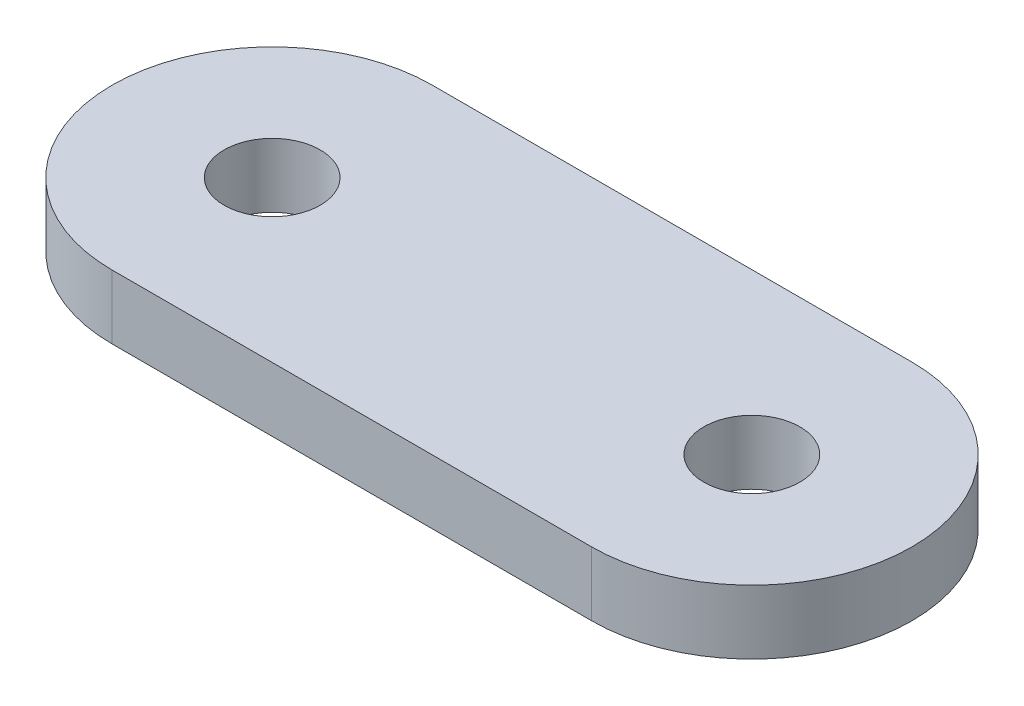
ISO-10303-21;
HEADER;
FILE_DESCRIPTION(('STEP AP214'),'2;1');
FILE_NAME('part.step','',(''),(''),'','','');
FILE_SCHEMA(('AUTOMOTIVE_DESIGN { 1 0 10303 214 1 1 1 1 }'));
ENDSEC;
DATA;
#1=APPLICATION_CONTEXT('core data for automotive mechanical design processes');
#2=APPLICATION_PROTOCOL_DEFINITION('international standard','automotive_design',2000,#1);
#3=PRODUCT_CONTEXT('',#1,'mechanical');
#4=PRODUCT('Part','Part','',(#3));
#5=PRODUCT_RELATED_PRODUCT_CATEGORY('part','',(#4));
#6=PRODUCT_DEFINITION_FORMATION('','',#4);
#7=PRODUCT_DEFINITION_CONTEXT('part definition',#1,'design');
#8=PRODUCT_DEFINITION('design','',#6,#7);
#9=PRODUCT_DEFINITION_SHAPE('','',#8);
#10=(LENGTH_UNIT() NAMED_UNIT(*) SI_UNIT(.MILLI.,.METRE.));
#11=(NAMED_UNIT(*) PLANE_ANGLE_UNIT() SI_UNIT($,.RADIAN.));
#12=(NAMED_UNIT(*) SI_UNIT($,.STERADIAN.) SOLID_ANGLE_UNIT());
#13=UNCERTAINTY_MEASURE_WITH_UNIT(LENGTH_MEASURE(1.E-05),#10,'distance_accuracy_value','');
#14=(GEOMETRIC_REPRESENTATION_CONTEXT(3) GLOBAL_UNCERTAINTY_ASSIGNED_CONTEXT((#13)) GLOBAL_UNIT_ASSIGNED_CONTEXT((#10,
#11,#12)) REPRESENTATION_CONTEXT('',''));
#15=CARTESIAN_POINT('',(0.,0.,0.));
#16=DIRECTION('',(0.,0.,1.));
#17=DIRECTION('',(1.,0.,0.));
#18=AXIS2_PLACEMENT_3D('',#15,#16,#17);
#19=CARTESIAN_POINT('',(-7.49,2.,0.));
#20=DIRECTION('',(0.,1.,0.));
#21=DIRECTION('',(0.,0.,1.));
#22=AXIS2_PLACEMENT_3D('',#19,#20,#21);
#23=PLANE('',#22);
#24=CARTESIAN_POINT('',(7.49,2.,0.));
#25=DIRECTION('',(0.,1.,0.));
#26=DIRECTION('',(0.,0.,1.));
#27=AXIS2_PLACEMENT_3D('',#24,#25,#26);
#28=CIRCLE('',#27,1.5);
#29=CARTESIAN_POINT('',(7.49,2.,1.5));
#30=VERTEX_POINT('',#29);
#31=EDGE_CURVE('E102',#30,#30,#28,.T.);
#32=ORIENTED_EDGE('',*,*,#31,.F.);
#33=EDGE_LOOP('',(#32));
#34=FACE_BOUND('',#33,.T.);
#35=CARTESIAN_POINT('',(-7.49,2.,0.));
#36=DIRECTION('',(0.,1.,0.));
#37=DIRECTION('',(0.,0.,1.));
#38=AXIS2_PLACEMENT_3D('',#35,#36,#37);
#39=CIRCLE('',#38,5.);
#40=CARTESIAN_POINT('',(-7.49,2.,-5.));
#41=VERTEX_POINT('',#40);
#42=CARTESIAN_POINT('',(-7.49,2.,5.));
#43=VERTEX_POINT('',#42);
#44=EDGE_CURVE('E87',#41,#43,#39,.T.);
#45=ORIENTED_EDGE('',*,*,#44,.T.);
#46=DIRECTION('',(1.,0.,0.));
#47=VECTOR('',#46,1.);
#48=CARTESIAN_POINT('',(-7.49,2.,5.));
#49=LINE('',#48,#47);
#50=CARTESIAN_POINT('',(7.49,2.,5.));
#51=VERTEX_POINT('',#50);
#52=EDGE_CURVE('E82',#43,#51,#49,.T.);
#53=ORIENTED_EDGE('',*,*,#52,.T.);
#54=CARTESIAN_POINT('',(7.49,2.,0.));
#55=DIRECTION('',(0.,1.,0.));
#56=DIRECTION('',(0.,0.,1.));
#57=AXIS2_PLACEMENT_3D('',#54,#55,#56);
#58=CIRCLE('',#57,5.);
#59=CARTESIAN_POINT('',(7.49,2.,-5.));
#60=VERTEX_POINT('',#59);
#61=EDGE_CURVE('E85',#51,#60,#58,.T.);
#62=ORIENTED_EDGE('',*,*,#61,.T.);
#63=DIRECTION('',(-1.,0.,0.));
#64=VECTOR('',#63,1.);
#65=CARTESIAN_POINT('',(-7.49,2.,-5.));
#66=LINE('',#65,#64);
#67=EDGE_CURVE('E52',#60,#41,#66,.T.);
#68=ORIENTED_EDGE('',*,*,#67,.T.);
#69=EDGE_LOOP('',(#45,#53,#62,#68));
#70=FACE_BOUND('',#69,.T.);
#71=CARTESIAN_POINT('',(-7.49,2.,0.));
#72=DIRECTION('',(0.,1.,0.));
#73=DIRECTION('',(0.,0.,1.));
#74=AXIS2_PLACEMENT_3D('',#71,#72,#73);
#75=CIRCLE('',#74,1.5);
#76=CARTESIAN_POINT('',(-7.49,2.,1.5));
#77=VERTEX_POINT('',#76);
#78=EDGE_CURVE('E117',#77,#77,#75,.T.);
#79=ORIENTED_EDGE('',*,*,#78,.F.);
#80=EDGE_LOOP('',(#79));
#81=FACE_BOUND('',#80,.T.);
#82=ADVANCED_FACE('F35',(#34,#70,#81),#23,.T.);
#83=CARTESIAN_POINT('',(-7.49,0.,0.));
#84=DIRECTION('',(0.,1.,0.));
#85=DIRECTION('',(0.,0.,1.));
#86=AXIS2_PLACEMENT_3D('',#83,#84,#85);
#87=PLANE('',#86);
#88=CARTESIAN_POINT('',(-7.49,0.,0.));
#89=DIRECTION('',(0.,1.,0.));
#90=DIRECTION('',(0.,0.,1.));
#91=AXIS2_PLACEMENT_3D('',#88,#89,#90);
#92=CIRCLE('',#91,5.);
#93=CARTESIAN_POINT('',(-7.49,0.,-5.));
#94=VERTEX_POINT('',#93);
#95=CARTESIAN_POINT('',(-7.49,0.,5.));
#96=VERTEX_POINT('',#95);
#97=EDGE_CURVE('E99',#94,#96,#92,.T.);
#98=ORIENTED_EDGE('',*,*,#97,.F.);
#99=DIRECTION('',(-1.,0.,0.));
#100=VECTOR('',#99,1.);
#101=CARTESIAN_POINT('',(-7.49,0.,-5.));
#102=LINE('',#101,#100);
#103=CARTESIAN_POINT('',(7.49,0.,-5.));
#104=VERTEX_POINT('',#103);
#105=EDGE_CURVE('E75',#104,#94,#102,.T.);
#106=ORIENTED_EDGE('',*,*,#105,.F.);
#107=CARTESIAN_POINT('',(7.49,0.,0.));
#108=DIRECTION('',(0.,1.,0.));
#109=DIRECTION('',(0.,0.,1.));
#110=AXIS2_PLACEMENT_3D('',#107,#108,#109);
#111=CIRCLE('',#110,5.);
#112=CARTESIAN_POINT('',(7.49,0.,5.));
#113=VERTEX_POINT('',#112);
#114=EDGE_CURVE('E69',#113,#104,#111,.T.);
#115=ORIENTED_EDGE('',*,*,#114,.F.);
#116=DIRECTION('',(1.,0.,0.));
#117=VECTOR('',#116,1.);
#118=CARTESIAN_POINT('',(-7.49,0.,5.));
#119=LINE('',#118,#117);
#120=EDGE_CURVE('E91',#96,#113,#119,.T.);
#121=ORIENTED_EDGE('',*,*,#120,.F.);
#122=EDGE_LOOP('',(#98,#106,#115,#121));
#123=FACE_BOUND('',#122,.T.);
#124=CARTESIAN_POINT('',(7.49,0.,0.));
#125=DIRECTION('',(0.,1.,0.));
#126=DIRECTION('',(0.,0.,1.));
#127=AXIS2_PLACEMENT_3D('',#124,#125,#126);
#128=CIRCLE('',#127,1.5);
#129=CARTESIAN_POINT('',(7.49,0.,1.5));
#130=VERTEX_POINT('',#129);
#131=EDGE_CURVE('E114',#130,#130,#128,.T.);
#132=ORIENTED_EDGE('',*,*,#131,.T.);
#133=EDGE_LOOP('',(#132));
#134=FACE_BOUND('',#133,.T.);
#135=CARTESIAN_POINT('',(-7.49,0.,0.));
#136=DIRECTION('',(0.,1.,0.));
#137=DIRECTION('',(0.,0.,1.));
#138=AXIS2_PLACEMENT_3D('',#135,#136,#137);
#139=CIRCLE('',#138,1.5);
#140=CARTESIAN_POINT('',(-7.49,0.,1.5));
#141=VERTEX_POINT('',#140);
#142=EDGE_CURVE('E120',#141,#141,#139,.T.);
#143=ORIENTED_EDGE('',*,*,#142,.T.);
#144=EDGE_LOOP('',(#143));
#145=FACE_BOUND('',#144,.T.);
#146=ADVANCED_FACE('F110',(#123,#134,#145),#87,.F.);
#147=CARTESIAN_POINT('',(-7.49,2.,0.));
#148=DIRECTION('',(0.,-1.,0.));
#149=DIRECTION('',(0.,0.,-1.));
#150=AXIS2_PLACEMENT_3D('',#147,#148,#149);
#151=CYLINDRICAL_SURFACE('',#150,5.);
#152=ORIENTED_EDGE('',*,*,#97,.T.);
#153=DIRECTION('',(0.,-1.,0.));
#154=VECTOR('',#153,1.);
#155=CARTESIAN_POINT('',(-7.49,2.,5.));
#156=LINE('',#155,#154);
#157=EDGE_CURVE('E11',#43,#96,#156,.T.);
#158=ORIENTED_EDGE('',*,*,#157,.F.);
#159=ORIENTED_EDGE('',*,*,#44,.F.);
#160=DIRECTION('',(0.,-1.,0.));
#161=VECTOR('',#160,1.);
#162=CARTESIAN_POINT('',(-7.49,2.,-5.));
#163=LINE('',#162,#161);
#164=EDGE_CURVE('E95',#41,#94,#163,.T.);
#165=ORIENTED_EDGE('',*,*,#164,.T.);
#166=EDGE_LOOP('',(#152,#158,#159,#165));
#167=FACE_BOUND('',#166,.T.);
#168=ADVANCED_FACE('F37',(#167),#151,.T.);
#169=CARTESIAN_POINT('',(-7.49,2.,5.));
#170=DIRECTION('',(0.,0.,-1.));
#171=DIRECTION('',(-1.,0.,0.));
#172=AXIS2_PLACEMENT_3D('',#169,#170,#171);
#173=PLANE('',#172);
#174=ORIENTED_EDGE('',*,*,#120,.T.);
#175=DIRECTION('',(0.,-1.,0.));
#176=VECTOR('',#175,1.);
#177=CARTESIAN_POINT('',(7.49,2.,5.));
#178=LINE('',#177,#176);
#179=EDGE_CURVE('E44',#51,#113,#178,.T.);
#180=ORIENTED_EDGE('',*,*,#179,.F.);
#181=ORIENTED_EDGE('',*,*,#52,.F.);
#182=ORIENTED_EDGE('',*,*,#157,.T.);
#183=EDGE_LOOP('',(#174,#180,#181,#182));
#184=FACE_BOUND('',#183,.T.);
#185=ADVANCED_FACE('F90',(#184),#173,.F.);
#186=CARTESIAN_POINT('',(7.49,2.,0.));
#187=DIRECTION('',(0.,-1.,0.));
#188=DIRECTION('',(0.,0.,-1.));
#189=AXIS2_PLACEMENT_3D('',#186,#187,#188);
#190=CYLINDRICAL_SURFACE('',#189,5.);
#191=ORIENTED_EDGE('',*,*,#114,.T.);
#192=DIRECTION('',(0.,-1.,0.));
#193=VECTOR('',#192,1.);
#194=CARTESIAN_POINT('',(7.49,2.,-5.));
#195=LINE('',#194,#193);
#196=EDGE_CURVE('E92',#60,#104,#195,.T.);
#197=ORIENTED_EDGE('',*,*,#196,.F.);
#198=ORIENTED_EDGE('',*,*,#61,.F.);
#199=ORIENTED_EDGE('',*,*,#179,.T.);
#200=EDGE_LOOP('',(#191,#197,#198,#199));
#201=FACE_BOUND('',#200,.T.);
#202=ADVANCED_FACE('F93',(#201),#190,.T.);
#203=CARTESIAN_POINT('',(-7.49,2.,-5.));
#204=DIRECTION('',(0.,0.,1.));
#205=DIRECTION('',(1.,0.,0.));
#206=AXIS2_PLACEMENT_3D('',#203,#204,#205);
#207=PLANE('',#206);
#208=ORIENTED_EDGE('',*,*,#105,.T.);
#209=ORIENTED_EDGE('',*,*,#164,.F.);
#210=ORIENTED_EDGE('',*,*,#67,.F.);
#211=ORIENTED_EDGE('',*,*,#196,.T.);
#212=EDGE_LOOP('',(#208,#209,#210,#211));
#213=FACE_BOUND('',#212,.T.);
#214=ADVANCED_FACE('F107',(#213),#207,.F.);
#215=CARTESIAN_POINT('',(7.49,2.,0.));
#216=DIRECTION('',(0.,-1.,0.));
#217=DIRECTION('',(0.,0.,-1.));
#218=AXIS2_PLACEMENT_3D('',#215,#216,#217);
#219=CYLINDRICAL_SURFACE('',#218,1.5);
#220=ORIENTED_EDGE('',*,*,#31,.T.);
#221=EDGE_LOOP('',(#220));
#222=FACE_BOUND('',#221,.T.);
#223=ORIENTED_EDGE('',*,*,#131,.F.);
#224=EDGE_LOOP('',(#223));
#225=FACE_BOUND('',#224,.T.);
#226=ADVANCED_FACE('F137',(#222,#225),#219,.F.);
#227=CARTESIAN_POINT('',(-7.49,2.,0.));
#228=DIRECTION('',(0.,-1.,0.));
#229=DIRECTION('',(0.,0.,-1.));
#230=AXIS2_PLACEMENT_3D('',#227,#228,#229);
#231=CYLINDRICAL_SURFACE('',#230,1.5);
#232=ORIENTED_EDGE('',*,*,#78,.T.);
#233=EDGE_LOOP('',(#232));
#234=FACE_BOUND('',#233,.T.);
#235=ORIENTED_EDGE('',*,*,#142,.F.);
#236=EDGE_LOOP('',(#235));
#237=FACE_BOUND('',#236,.T.);
#238=ADVANCED_FACE('F126',(#234,#237),#231,.F.);
#239=CLOSED_SHELL('',(#82,#146,#168,#185,#202,#214,#226,#238));
#240=MANIFOLD_SOLID_BREP('B2',#239);
#241=ADVANCED_BREP_SHAPE_REPRESENTATION('',(#18,#240),#14);
#242=SHAPE_DEFINITION_REPRESENTATION(#9,#241);
ENDSEC;
END-ISO-10303-21;
